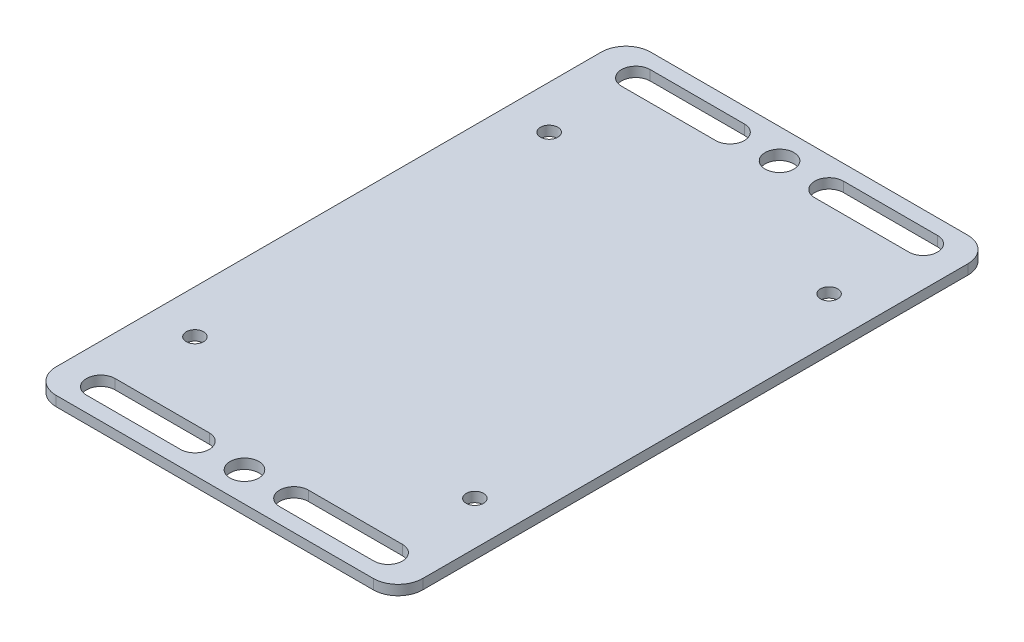
ISO-10303-21;
HEADER;
FILE_DESCRIPTION(('STEP AP214'),'2;1');
FILE_NAME('part.step','',(''),(''),'','','');
FILE_SCHEMA(('AUTOMOTIVE_DESIGN { 1 0 10303 214 1 1 1 1 }'));
ENDSEC;
DATA;
#1=APPLICATION_CONTEXT('core data for automotive mechanical design processes');
#2=APPLICATION_PROTOCOL_DEFINITION('international standard','automotive_design',2000,#1);
#3=PRODUCT_CONTEXT('',#1,'mechanical');
#4=PRODUCT('Part','Part','',(#3));
#5=PRODUCT_RELATED_PRODUCT_CATEGORY('part','',(#4));
#6=PRODUCT_DEFINITION_FORMATION('','',#4);
#7=PRODUCT_DEFINITION_CONTEXT('part definition',#1,'design');
#8=PRODUCT_DEFINITION('design','',#6,#7);
#9=PRODUCT_DEFINITION_SHAPE('','',#8);
#10=(LENGTH_UNIT() NAMED_UNIT(*) SI_UNIT(.MILLI.,.METRE.));
#11=(NAMED_UNIT(*) PLANE_ANGLE_UNIT() SI_UNIT($,.RADIAN.));
#12=(NAMED_UNIT(*) SI_UNIT($,.STERADIAN.) SOLID_ANGLE_UNIT());
#13=UNCERTAINTY_MEASURE_WITH_UNIT(LENGTH_MEASURE(1.E-05),#10,'distance_accuracy_value','');
#14=(GEOMETRIC_REPRESENTATION_CONTEXT(3) GLOBAL_UNCERTAINTY_ASSIGNED_CONTEXT((#13)) GLOBAL_UNIT_ASSIGNED_CONTEXT((#10,
#11,#12)) REPRESENTATION_CONTEXT('',''));
#15=CARTESIAN_POINT('',(0.,0.,0.));
#16=DIRECTION('',(0.,0.,1.));
#17=DIRECTION('',(1.,0.,0.));
#18=AXIS2_PLACEMENT_3D('',#15,#16,#17);
#19=CARTESIAN_POINT('',(0.,2.,0.));
#20=DIRECTION('',(0.,1.,0.));
#21=DIRECTION('',(0.,0.,1.));
#22=AXIS2_PLACEMENT_3D('',#19,#20,#21);
#23=PLANE('',#22);
#24=CARTESIAN_POINT('',(28.25,2.,-35.75));
#25=DIRECTION('',(0.,1.,0.));
#26=DIRECTION('',(0.,0.,1.));
#27=AXIS2_PLACEMENT_3D('',#24,#25,#26);
#28=CIRCLE('',#27,1.75);
#29=CARTESIAN_POINT('',(28.25,2.,-34.));
#30=VERTEX_POINT('',#29);
#31=EDGE_CURVE('E719',#30,#30,#28,.T.);
#32=ORIENTED_EDGE('',*,*,#31,.F.);
#33=EDGE_LOOP('',(#32));
#34=FACE_BOUND('',#33,.T.);
#35=CARTESIAN_POINT('',(-28.25,2.,35.75));
#36=DIRECTION('',(0.,1.,0.));
#37=DIRECTION('',(0.,0.,1.));
#38=AXIS2_PLACEMENT_3D('',#35,#36,#37);
#39=CIRCLE('',#38,1.75);
#40=CARTESIAN_POINT('',(-28.25,2.,37.5));
#41=VERTEX_POINT('',#40);
#42=EDGE_CURVE('E724',#41,#41,#39,.T.);
#43=ORIENTED_EDGE('',*,*,#42,.F.);
#44=EDGE_LOOP('',(#43));
#45=FACE_BOUND('',#44,.T.);
#46=CARTESIAN_POINT('',(28.25,2.,35.75));
#47=DIRECTION('',(0.,1.,0.));
#48=DIRECTION('',(0.,0.,1.));
#49=AXIS2_PLACEMENT_3D('',#46,#47,#48);
#50=CIRCLE('',#49,1.75);
#51=CARTESIAN_POINT('',(28.25,2.,37.5));
#52=VERTEX_POINT('',#51);
#53=EDGE_CURVE('E740',#52,#52,#50,.T.);
#54=ORIENTED_EDGE('',*,*,#53,.F.);
#55=EDGE_LOOP('',(#54));
#56=FACE_BOUND('',#55,.T.);
#57=CARTESIAN_POINT('',(-28.25,2.,-35.75));
#58=DIRECTION('',(0.,1.,0.));
#59=DIRECTION('',(0.,0.,1.));
#60=AXIS2_PLACEMENT_3D('',#57,#58,#59);
#61=CIRCLE('',#60,1.75);
#62=CARTESIAN_POINT('',(-28.25,2.,-34.));
#63=VERTEX_POINT('',#62);
#64=EDGE_CURVE('E231',#63,#63,#61,.T.);
#65=ORIENTED_EDGE('',*,*,#64,.F.);
#66=EDGE_LOOP('',(#65));
#67=FACE_BOUND('',#66,.T.);
#68=DIRECTION('',(-1.,0.,0.));
#69=VECTOR('',#68,1.);
#70=CARTESIAN_POINT('',(9.99999999999999,2.,56.9));
#71=LINE('',#70,#69);
#72=CARTESIAN_POINT('',(29.,2.,56.9));
#73=VERTEX_POINT('',#72);
#74=CARTESIAN_POINT('',(9.99999999999999,2.,56.9));
#75=VERTEX_POINT('',#74);
#76=EDGE_CURVE('E268',#73,#75,#71,.T.);
#77=ORIENTED_EDGE('',*,*,#76,.T.);
#78=CARTESIAN_POINT('',(9.99999999999999,2.,54.));
#79=DIRECTION('',(0.,-1.,0.));
#80=DIRECTION('',(0.,0.,-1.));
#81=AXIS2_PLACEMENT_3D('',#78,#79,#80);
#82=CIRCLE('',#81,2.9);
#83=CARTESIAN_POINT('',(9.99999999999999,2.,51.1));
#84=VERTEX_POINT('',#83);
#85=EDGE_CURVE('E265',#75,#84,#82,.T.);
#86=ORIENTED_EDGE('',*,*,#85,.T.);
#87=DIRECTION('',(1.,0.,0.));
#88=VECTOR('',#87,1.);
#89=CARTESIAN_POINT('',(9.99999999999999,2.,51.1));
#90=LINE('',#89,#88);
#91=CARTESIAN_POINT('',(29.,2.,51.1));
#92=VERTEX_POINT('',#91);
#93=EDGE_CURVE('E257',#84,#92,#90,.T.);
#94=ORIENTED_EDGE('',*,*,#93,.T.);
#95=CARTESIAN_POINT('',(29.,2.,54.));
#96=DIRECTION('',(0.,-1.,0.));
#97=DIRECTION('',(0.,0.,-1.));
#98=AXIS2_PLACEMENT_3D('',#95,#96,#97);
#99=CIRCLE('',#98,2.9);
#100=EDGE_CURVE('E272',#92,#73,#99,.T.);
#101=ORIENTED_EDGE('',*,*,#100,.T.);
#102=EDGE_LOOP('',(#77,#86,#94,#101));
#103=FACE_BOUND('',#102,.T.);
#104=DIRECTION('',(0.,0.,1.));
#105=VECTOR('',#104,1.);
#106=CARTESIAN_POINT('',(-37.,2.,-60.));
#107=LINE('',#106,#105);
#108=CARTESIAN_POINT('',(-37.,2.,-55.));
#109=VERTEX_POINT('',#108);
#110=CARTESIAN_POINT('',(-37.,2.,55.));
#111=VERTEX_POINT('',#110);
#112=EDGE_CURVE('E360',#109,#111,#107,.T.);
#113=ORIENTED_EDGE('',*,*,#112,.T.);
#114=CARTESIAN_POINT('',(-32.,2.,55.));
#115=DIRECTION('',(0.,1.,0.));
#116=DIRECTION('',(0.,0.,1.));
#117=AXIS2_PLACEMENT_3D('',#114,#115,#116);
#118=CIRCLE('',#117,5.);
#119=CARTESIAN_POINT('',(-32.,2.,60.));
#120=VERTEX_POINT('',#119);
#121=EDGE_CURVE('E398',#111,#120,#118,.T.);
#122=ORIENTED_EDGE('',*,*,#121,.T.);
#123=DIRECTION('',(1.,0.,0.));
#124=VECTOR('',#123,1.);
#125=CARTESIAN_POINT('',(-37.,2.,60.));
#126=LINE('',#125,#124);
#127=CARTESIAN_POINT('',(32.,2.,60.));
#128=VERTEX_POINT('',#127);
#129=EDGE_CURVE('E363',#120,#128,#126,.T.);
#130=ORIENTED_EDGE('',*,*,#129,.T.);
#131=CARTESIAN_POINT('',(32.,2.,55.));
#132=DIRECTION('',(0.,1.,0.));
#133=DIRECTION('',(0.,0.,1.));
#134=AXIS2_PLACEMENT_3D('',#131,#132,#133);
#135=CIRCLE('',#134,5.);
#136=CARTESIAN_POINT('',(37.,2.,55.));
#137=VERTEX_POINT('',#136);
#138=EDGE_CURVE('E396',#128,#137,#135,.T.);
#139=ORIENTED_EDGE('',*,*,#138,.T.);
#140=DIRECTION('',(0.,0.,-1.));
#141=VECTOR('',#140,1.);
#142=CARTESIAN_POINT('',(37.,2.,-60.));
#143=LINE('',#142,#141);
#144=CARTESIAN_POINT('',(37.,2.,-55.));
#145=VERTEX_POINT('',#144);
#146=EDGE_CURVE('E355',#137,#145,#143,.T.);
#147=ORIENTED_EDGE('',*,*,#146,.T.);
#148=CARTESIAN_POINT('',(32.,2.,-55.));
#149=DIRECTION('',(0.,1.,0.));
#150=DIRECTION('',(0.,0.,1.));
#151=AXIS2_PLACEMENT_3D('',#148,#149,#150);
#152=CIRCLE('',#151,5.);
#153=CARTESIAN_POINT('',(32.,2.,-60.));
#154=VERTEX_POINT('',#153);
#155=EDGE_CURVE('E60',#145,#154,#152,.T.);
#156=ORIENTED_EDGE('',*,*,#155,.T.);
#157=DIRECTION('',(-1.,0.,0.));
#158=VECTOR('',#157,1.);
#159=CARTESIAN_POINT('',(-37.,2.,-60.));
#160=LINE('',#159,#158);
#161=CARTESIAN_POINT('',(-32.,2.,-60.));
#162=VERTEX_POINT('',#161);
#163=EDGE_CURVE('E357',#154,#162,#160,.T.);
#164=ORIENTED_EDGE('',*,*,#163,.T.);
#165=CARTESIAN_POINT('',(-32.,2.,-55.));
#166=DIRECTION('',(0.,1.,0.));
#167=DIRECTION('',(0.,0.,1.));
#168=AXIS2_PLACEMENT_3D('',#165,#166,#167);
#169=CIRCLE('',#168,5.);
#170=EDGE_CURVE('E393',#162,#109,#169,.T.);
#171=ORIENTED_EDGE('',*,*,#170,.T.);
#172=EDGE_LOOP('',(#113,#122,#130,#139,#147,#156,#164,#171));
#173=FACE_BOUND('',#172,.T.);
#174=CARTESIAN_POINT('',(9.99999999999999,2.,-54.));
#175=DIRECTION('',(0.,1.,0.));
#176=DIRECTION('',(0.,0.,1.));
#177=AXIS2_PLACEMENT_3D('',#174,#175,#176);
#178=CIRCLE('',#177,2.9);
#179=CARTESIAN_POINT('',(9.99999999999999,2.,-56.9));
#180=VERTEX_POINT('',#179);
#181=CARTESIAN_POINT('',(9.99999999999999,2.,-51.1));
#182=VERTEX_POINT('',#181);
#183=EDGE_CURVE('E244',#180,#182,#178,.T.);
#184=ORIENTED_EDGE('',*,*,#183,.F.);
#185=DIRECTION('',(-1.,0.,0.));
#186=VECTOR('',#185,1.);
#187=CARTESIAN_POINT('',(9.99999999999999,2.,-56.9));
#188=LINE('',#187,#186);
#189=CARTESIAN_POINT('',(29.,2.,-56.9));
#190=VERTEX_POINT('',#189);
#191=EDGE_CURVE('E329',#190,#180,#188,.T.);
#192=ORIENTED_EDGE('',*,*,#191,.F.);
#193=CARTESIAN_POINT('',(29.,2.,-54.));
#194=DIRECTION('',(0.,1.,0.));
#195=DIRECTION('',(0.,0.,1.));
#196=AXIS2_PLACEMENT_3D('',#193,#194,#195);
#197=CIRCLE('',#196,2.9);
#198=CARTESIAN_POINT('',(29.,2.,-51.1));
#199=VERTEX_POINT('',#198);
#200=EDGE_CURVE('E343',#199,#190,#197,.T.);
#201=ORIENTED_EDGE('',*,*,#200,.F.);
#202=DIRECTION('',(1.,0.,0.));
#203=VECTOR('',#202,1.);
#204=CARTESIAN_POINT('',(9.99999999999999,2.,-51.1));
#205=LINE('',#204,#203);
#206=EDGE_CURVE('E340',#182,#199,#205,.T.);
#207=ORIENTED_EDGE('',*,*,#206,.F.);
#208=EDGE_LOOP('',(#184,#192,#201,#207));
#209=FACE_BOUND('',#208,.T.);
#210=CARTESIAN_POINT('',(0.,2.,-54.));
#211=DIRECTION('',(0.,1.,0.));
#212=DIRECTION('',(0.,0.,1.));
#213=AXIS2_PLACEMENT_3D('',#210,#211,#212);
#214=CIRCLE('',#213,2.9);
#215=CARTESIAN_POINT('',(0.,2.,-51.1));
#216=VERTEX_POINT('',#215);
#217=EDGE_CURVE('E321',#216,#216,#214,.T.);
#218=ORIENTED_EDGE('',*,*,#217,.F.);
#219=EDGE_LOOP('',(#218));
#220=FACE_BOUND('',#219,.T.);
#221=CARTESIAN_POINT('',(-29.,2.,-54.));
#222=DIRECTION('',(0.,1.,0.));
#223=DIRECTION('',(0.,0.,1.));
#224=AXIS2_PLACEMENT_3D('',#221,#222,#223);
#225=CIRCLE('',#224,2.9);
#226=CARTESIAN_POINT('',(-29.,2.,-56.9));
#227=VERTEX_POINT('',#226);
#228=CARTESIAN_POINT('',(-29.,2.,-51.1));
#229=VERTEX_POINT('',#228);
#230=EDGE_CURVE('E299',#227,#229,#225,.T.);
#231=ORIENTED_EDGE('',*,*,#230,.F.);
#232=DIRECTION('',(-1.,0.,0.));
#233=VECTOR('',#232,1.);
#234=CARTESIAN_POINT('',(-29.,2.,-56.9));
#235=LINE('',#234,#233);
#236=CARTESIAN_POINT('',(-10.,2.,-56.9));
#237=VERTEX_POINT('',#236);
#238=EDGE_CURVE('E289',#237,#227,#235,.T.);
#239=ORIENTED_EDGE('',*,*,#238,.F.);
#240=CARTESIAN_POINT('',(-10.,2.,-54.));
#241=DIRECTION('',(0.,1.,0.));
#242=DIRECTION('',(0.,0.,1.));
#243=AXIS2_PLACEMENT_3D('',#240,#241,#242);
#244=CIRCLE('',#243,2.9);
#245=CARTESIAN_POINT('',(-10.,2.,-51.1));
#246=VERTEX_POINT('',#245);
#247=EDGE_CURVE('E305',#246,#237,#244,.T.);
#248=ORIENTED_EDGE('',*,*,#247,.F.);
#249=DIRECTION('',(1.,0.,0.));
#250=VECTOR('',#249,1.);
#251=CARTESIAN_POINT('',(-29.,2.,-51.1));
#252=LINE('',#251,#250);
#253=EDGE_CURVE('E301',#229,#246,#252,.T.);
#254=ORIENTED_EDGE('',*,*,#253,.F.);
#255=EDGE_LOOP('',(#231,#239,#248,#254));
#256=FACE_BOUND('',#255,.T.);
#257=CARTESIAN_POINT('',(0.,2.,54.));
#258=DIRECTION('',(0.,-1.,0.));
#259=DIRECTION('',(0.,0.,-1.));
#260=AXIS2_PLACEMENT_3D('',#257,#258,#259);
#261=CIRCLE('',#260,2.9);
#262=CARTESIAN_POINT('',(0.,2.,51.1));
#263=VERTEX_POINT('',#262);
#264=EDGE_CURVE('E250',#263,#263,#261,.T.);
#265=ORIENTED_EDGE('',*,*,#264,.T.);
#266=EDGE_LOOP('',(#265));
#267=FACE_BOUND('',#266,.T.);
#268=DIRECTION('',(-1.,0.,0.));
#269=VECTOR('',#268,1.);
#270=CARTESIAN_POINT('',(-29.,2.,56.9));
#271=LINE('',#270,#269);
#272=CARTESIAN_POINT('',(-10.,2.,56.9));
#273=VERTEX_POINT('',#272);
#274=CARTESIAN_POINT('',(-29.,2.,56.9));
#275=VERTEX_POINT('',#274);
#276=EDGE_CURVE('E237',#273,#275,#271,.T.);
#277=ORIENTED_EDGE('',*,*,#276,.T.);
#278=CARTESIAN_POINT('',(-29.,2.,54.));
#279=DIRECTION('',(0.,-1.,0.));
#280=DIRECTION('',(0.,0.,-1.));
#281=AXIS2_PLACEMENT_3D('',#278,#279,#280);
#282=CIRCLE('',#281,2.9);
#283=CARTESIAN_POINT('',(-29.,2.,51.1));
#284=VERTEX_POINT('',#283);
#285=EDGE_CURVE('E220',#275,#284,#282,.T.);
#286=ORIENTED_EDGE('',*,*,#285,.T.);
#287=DIRECTION('',(1.,0.,0.));
#288=VECTOR('',#287,1.);
#289=CARTESIAN_POINT('',(-29.,2.,51.1));
#290=LINE('',#289,#288);
#291=CARTESIAN_POINT('',(-10.,2.,51.1));
#292=VERTEX_POINT('',#291);
#293=EDGE_CURVE('E225',#284,#292,#290,.T.);
#294=ORIENTED_EDGE('',*,*,#293,.T.);
#295=CARTESIAN_POINT('',(-10.,2.,54.));
#296=DIRECTION('',(0.,-1.,0.));
#297=DIRECTION('',(0.,0.,-1.));
#298=AXIS2_PLACEMENT_3D('',#295,#296,#297);
#299=CIRCLE('',#298,2.9);
#300=EDGE_CURVE('E228',#292,#273,#299,.T.);
#301=ORIENTED_EDGE('',*,*,#300,.T.);
#302=EDGE_LOOP('',(#277,#286,#294,#301));
#303=FACE_BOUND('',#302,.T.);
#304=ADVANCED_FACE('F39',(#34,#45,#56,#67,#103,#173,#209,#220,#256,#267,#303),#23,.T.);
#305=CARTESIAN_POINT('',(0.,0.,0.));
#306=DIRECTION('',(0.,1.,0.));
#307=DIRECTION('',(0.,0.,1.));
#308=AXIS2_PLACEMENT_3D('',#305,#306,#307);
#309=PLANE('',#308);
#310=CARTESIAN_POINT('',(28.25,0.,-35.75));
#311=DIRECTION('',(0.,1.,0.));
#312=DIRECTION('',(0.,0.,1.));
#313=AXIS2_PLACEMENT_3D('',#310,#311,#312);
#314=CIRCLE('',#313,1.75);
#315=CARTESIAN_POINT('',(28.25,0.,-34.));
#316=VERTEX_POINT('',#315);
#317=EDGE_CURVE('E717',#316,#316,#314,.T.);
#318=ORIENTED_EDGE('',*,*,#317,.T.);
#319=EDGE_LOOP('',(#318));
#320=FACE_BOUND('',#319,.T.);
#321=CARTESIAN_POINT('',(-28.25,0.,35.75));
#322=DIRECTION('',(0.,1.,0.));
#323=DIRECTION('',(0.,0.,1.));
#324=AXIS2_PLACEMENT_3D('',#321,#322,#323);
#325=CIRCLE('',#324,1.75);
#326=CARTESIAN_POINT('',(-28.25,0.,37.5));
#327=VERTEX_POINT('',#326);
#328=EDGE_CURVE('E720',#327,#327,#325,.T.);
#329=ORIENTED_EDGE('',*,*,#328,.T.);
#330=EDGE_LOOP('',(#329));
#331=FACE_BOUND('',#330,.T.);
#332=CARTESIAN_POINT('',(28.25,0.,35.75));
#333=DIRECTION('',(0.,1.,0.));
#334=DIRECTION('',(0.,0.,1.));
#335=AXIS2_PLACEMENT_3D('',#332,#333,#334);
#336=CIRCLE('',#335,1.75);
#337=CARTESIAN_POINT('',(28.25,0.,37.5));
#338=VERTEX_POINT('',#337);
#339=EDGE_CURVE('E729',#338,#338,#336,.T.);
#340=ORIENTED_EDGE('',*,*,#339,.T.);
#341=EDGE_LOOP('',(#340));
#342=FACE_BOUND('',#341,.T.);
#343=CARTESIAN_POINT('',(-28.25,0.,-35.75));
#344=DIRECTION('',(0.,1.,0.));
#345=DIRECTION('',(0.,0.,1.));
#346=AXIS2_PLACEMENT_3D('',#343,#344,#345);
#347=CIRCLE('',#346,1.75);
#348=CARTESIAN_POINT('',(-28.25,0.,-34.));
#349=VERTEX_POINT('',#348);
#350=EDGE_CURVE('E269',#349,#349,#347,.T.);
#351=ORIENTED_EDGE('',*,*,#350,.T.);
#352=EDGE_LOOP('',(#351));
#353=FACE_BOUND('',#352,.T.);
#354=CARTESIAN_POINT('',(0.,0.,54.));
#355=DIRECTION('',(0.,-1.,0.));
#356=DIRECTION('',(0.,0.,-1.));
#357=AXIS2_PLACEMENT_3D('',#354,#355,#356);
#358=CIRCLE('',#357,2.9);
#359=CARTESIAN_POINT('',(0.,0.,51.1));
#360=VERTEX_POINT('',#359);
#361=EDGE_CURVE('E238',#360,#360,#358,.T.);
#362=ORIENTED_EDGE('',*,*,#361,.F.);
#363=EDGE_LOOP('',(#362));
#364=FACE_BOUND('',#363,.T.);
#365=CARTESIAN_POINT('',(9.99999999999999,0.,54.));
#366=DIRECTION('',(0.,-1.,0.));
#367=DIRECTION('',(0.,0.,-1.));
#368=AXIS2_PLACEMENT_3D('',#365,#366,#367);
#369=CIRCLE('',#368,2.9);
#370=CARTESIAN_POINT('',(9.99999999999999,0.,56.9));
#371=VERTEX_POINT('',#370);
#372=CARTESIAN_POINT('',(9.99999999999999,0.,51.1));
#373=VERTEX_POINT('',#372);
#374=EDGE_CURVE('E254',#371,#373,#369,.T.);
#375=ORIENTED_EDGE('',*,*,#374,.F.);
#376=DIRECTION('',(-1.,0.,0.));
#377=VECTOR('',#376,1.);
#378=CARTESIAN_POINT('',(9.99999999999999,0.,56.9));
#379=LINE('',#378,#377);
#380=CARTESIAN_POINT('',(29.,0.,56.9));
#381=VERTEX_POINT('',#380);
#382=EDGE_CURVE('E256',#381,#371,#379,.T.);
#383=ORIENTED_EDGE('',*,*,#382,.F.);
#384=CARTESIAN_POINT('',(29.,0.,54.));
#385=DIRECTION('',(0.,-1.,0.));
#386=DIRECTION('',(0.,0.,-1.));
#387=AXIS2_PLACEMENT_3D('',#384,#385,#386);
#388=CIRCLE('',#387,2.9);
#389=CARTESIAN_POINT('',(29.,0.,51.1));
#390=VERTEX_POINT('',#389);
#391=EDGE_CURVE('E259',#390,#381,#388,.T.);
#392=ORIENTED_EDGE('',*,*,#391,.F.);
#393=DIRECTION('',(1.,0.,0.));
#394=VECTOR('',#393,1.);
#395=CARTESIAN_POINT('',(9.99999999999999,0.,51.1));
#396=LINE('',#395,#394);
#397=EDGE_CURVE('E262',#373,#390,#396,.T.);
#398=ORIENTED_EDGE('',*,*,#397,.F.);
#399=EDGE_LOOP('',(#375,#383,#392,#398));
#400=FACE_BOUND('',#399,.T.);
#401=DIRECTION('',(-1.,0.,0.));
#402=VECTOR('',#401,1.);
#403=CARTESIAN_POINT('',(-29.,0.,-56.9));
#404=LINE('',#403,#402);
#405=CARTESIAN_POINT('',(-10.,0.,-56.9));
#406=VERTEX_POINT('',#405);
#407=CARTESIAN_POINT('',(-29.,0.,-56.9));
#408=VERTEX_POINT('',#407);
#409=EDGE_CURVE('E295',#406,#408,#404,.T.);
#410=ORIENTED_EDGE('',*,*,#409,.T.);
#411=CARTESIAN_POINT('',(-29.,0.,-54.));
#412=DIRECTION('',(0.,1.,0.));
#413=DIRECTION('',(0.,0.,1.));
#414=AXIS2_PLACEMENT_3D('',#411,#412,#413);
#415=CIRCLE('',#414,2.9);
#416=CARTESIAN_POINT('',(-29.,0.,-51.1));
#417=VERTEX_POINT('',#416);
#418=EDGE_CURVE('E285',#408,#417,#415,.T.);
#419=ORIENTED_EDGE('',*,*,#418,.T.);
#420=DIRECTION('',(1.,0.,0.));
#421=VECTOR('',#420,1.);
#422=CARTESIAN_POINT('',(-29.,0.,-51.1));
#423=LINE('',#422,#421);
#424=CARTESIAN_POINT('',(-10.,0.,-51.1));
#425=VERTEX_POINT('',#424);
#426=EDGE_CURVE('E288',#417,#425,#423,.T.);
#427=ORIENTED_EDGE('',*,*,#426,.T.);
#428=CARTESIAN_POINT('',(-10.,0.,-54.));
#429=DIRECTION('',(0.,1.,0.));
#430=DIRECTION('',(0.,0.,1.));
#431=AXIS2_PLACEMENT_3D('',#428,#429,#430);
#432=CIRCLE('',#431,2.9);
#433=EDGE_CURVE('E292',#425,#406,#432,.T.);
#434=ORIENTED_EDGE('',*,*,#433,.T.);
#435=EDGE_LOOP('',(#410,#419,#427,#434));
#436=FACE_BOUND('',#435,.T.);
#437=CARTESIAN_POINT('',(0.,0.,-54.));
#438=DIRECTION('',(0.,1.,0.));
#439=DIRECTION('',(0.,0.,1.));
#440=AXIS2_PLACEMENT_3D('',#437,#438,#439);
#441=CIRCLE('',#440,2.9);
#442=CARTESIAN_POINT('',(0.,0.,-51.1));
#443=VERTEX_POINT('',#442);
#444=EDGE_CURVE('E302',#443,#443,#441,.T.);
#445=ORIENTED_EDGE('',*,*,#444,.T.);
#446=EDGE_LOOP('',(#445));
#447=FACE_BOUND('',#446,.T.);
#448=DIRECTION('',(-1.,0.,0.));
#449=VECTOR('',#448,1.);
#450=CARTESIAN_POINT('',(9.99999999999999,0.,-56.9));
#451=LINE('',#450,#449);
#452=CARTESIAN_POINT('',(29.,0.,-56.9));
#453=VERTEX_POINT('',#452);
#454=CARTESIAN_POINT('',(9.99999999999999,0.,-56.9));
#455=VERTEX_POINT('',#454);
#456=EDGE_CURVE('E335',#453,#455,#451,.T.);
#457=ORIENTED_EDGE('',*,*,#456,.T.);
#458=CARTESIAN_POINT('',(9.99999999999999,0.,-54.));
#459=DIRECTION('',(0.,1.,0.));
#460=DIRECTION('',(0.,0.,1.));
#461=AXIS2_PLACEMENT_3D('',#458,#459,#460);
#462=CIRCLE('',#461,2.9);
#463=CARTESIAN_POINT('',(9.99999999999999,0.,-51.1));
#464=VERTEX_POINT('',#463);
#465=EDGE_CURVE('E325',#455,#464,#462,.T.);
#466=ORIENTED_EDGE('',*,*,#465,.T.);
#467=DIRECTION('',(1.,0.,0.));
#468=VECTOR('',#467,1.);
#469=CARTESIAN_POINT('',(9.99999999999999,0.,-51.1));
#470=LINE('',#469,#468);
#471=CARTESIAN_POINT('',(29.,0.,-51.1));
#472=VERTEX_POINT('',#471);
#473=EDGE_CURVE('E328',#464,#472,#470,.T.);
#474=ORIENTED_EDGE('',*,*,#473,.T.);
#475=CARTESIAN_POINT('',(29.,0.,-54.));
#476=DIRECTION('',(0.,1.,0.));
#477=DIRECTION('',(0.,0.,1.));
#478=AXIS2_PLACEMENT_3D('',#475,#476,#477);
#479=CIRCLE('',#478,2.9);
#480=EDGE_CURVE('E332',#472,#453,#479,.T.);
#481=ORIENTED_EDGE('',*,*,#480,.T.);
#482=EDGE_LOOP('',(#457,#466,#474,#481));
#483=FACE_BOUND('',#482,.T.);
#484=DIRECTION('',(1.,0.,0.));
#485=VECTOR('',#484,1.);
#486=CARTESIAN_POINT('',(-37.,0.,60.));
#487=LINE('',#486,#485);
#488=CARTESIAN_POINT('',(-32.,0.,60.));
#489=VERTEX_POINT('',#488);
#490=CARTESIAN_POINT('',(32.,0.,60.));
#491=VERTEX_POINT('',#490);
#492=EDGE_CURVE('E358',#489,#491,#487,.T.);
#493=ORIENTED_EDGE('',*,*,#492,.F.);
#494=CARTESIAN_POINT('',(-32.,0.,55.));
#495=DIRECTION('',(0.,1.,0.));
#496=DIRECTION('',(0.,0.,1.));
#497=AXIS2_PLACEMENT_3D('',#494,#495,#496);
#498=CIRCLE('',#497,5.);
#499=CARTESIAN_POINT('',(-37.,0.,55.));
#500=VERTEX_POINT('',#499);
#501=EDGE_CURVE('E386',#489,#500,#498,.F.);
#502=ORIENTED_EDGE('',*,*,#501,.T.);
#503=DIRECTION('',(0.,0.,1.));
#504=VECTOR('',#503,1.);
#505=CARTESIAN_POINT('',(-37.,0.,-60.));
#506=LINE('',#505,#504);
#507=CARTESIAN_POINT('',(-37.,0.,-55.));
#508=VERTEX_POINT('',#507);
#509=EDGE_CURVE('E371',#508,#500,#506,.T.);
#510=ORIENTED_EDGE('',*,*,#509,.F.);
#511=CARTESIAN_POINT('',(-32.,0.,-55.));
#512=DIRECTION('',(0.,1.,0.));
#513=DIRECTION('',(0.,0.,1.));
#514=AXIS2_PLACEMENT_3D('',#511,#512,#513);
#515=CIRCLE('',#514,5.);
#516=CARTESIAN_POINT('',(-32.,0.,-60.));
#517=VERTEX_POINT('',#516);
#518=EDGE_CURVE('E380',#508,#517,#515,.F.);
#519=ORIENTED_EDGE('',*,*,#518,.T.);
#520=DIRECTION('',(-1.,0.,0.));
#521=VECTOR('',#520,1.);
#522=CARTESIAN_POINT('',(-37.,0.,-60.));
#523=LINE('',#522,#521);
#524=CARTESIAN_POINT('',(32.,0.,-60.));
#525=VERTEX_POINT('',#524);
#526=EDGE_CURVE('E369',#525,#517,#523,.T.);
#527=ORIENTED_EDGE('',*,*,#526,.F.);
#528=CARTESIAN_POINT('',(32.,0.,-55.));
#529=DIRECTION('',(0.,1.,0.));
#530=DIRECTION('',(0.,0.,1.));
#531=AXIS2_PLACEMENT_3D('',#528,#529,#530);
#532=CIRCLE('',#531,5.);
#533=CARTESIAN_POINT('',(37.,0.,-55.));
#534=VERTEX_POINT('',#533);
#535=EDGE_CURVE('E382',#525,#534,#532,.F.);
#536=ORIENTED_EDGE('',*,*,#535,.T.);
#537=DIRECTION('',(0.,0.,-1.));
#538=VECTOR('',#537,1.);
#539=CARTESIAN_POINT('',(37.,0.,-60.));
#540=LINE('',#539,#538);
#541=CARTESIAN_POINT('',(37.,0.,55.));
#542=VERTEX_POINT('',#541);
#543=EDGE_CURVE('E312',#542,#534,#540,.T.);
#544=ORIENTED_EDGE('',*,*,#543,.F.);
#545=CARTESIAN_POINT('',(32.,0.,55.));
#546=DIRECTION('',(0.,1.,0.));
#547=DIRECTION('',(0.,0.,1.));
#548=AXIS2_PLACEMENT_3D('',#545,#546,#547);
#549=CIRCLE('',#548,5.);
#550=EDGE_CURVE('E384',#542,#491,#549,.F.);
#551=ORIENTED_EDGE('',*,*,#550,.T.);
#552=EDGE_LOOP('',(#493,#502,#510,#519,#527,#536,#544,#551));
#553=FACE_BOUND('',#552,.T.);
#554=CARTESIAN_POINT('',(-29.,0.,54.));
#555=DIRECTION('',(0.,-1.,0.));
#556=DIRECTION('',(0.,0.,-1.));
#557=AXIS2_PLACEMENT_3D('',#554,#555,#556);
#558=CIRCLE('',#557,2.9);
#559=CARTESIAN_POINT('',(-29.,0.,56.9));
#560=VERTEX_POINT('',#559);
#561=CARTESIAN_POINT('',(-29.,0.,51.1));
#562=VERTEX_POINT('',#561);
#563=EDGE_CURVE('E213',#560,#562,#558,.T.);
#564=ORIENTED_EDGE('',*,*,#563,.F.);
#565=DIRECTION('',(-1.,0.,0.));
#566=VECTOR('',#565,1.);
#567=CARTESIAN_POINT('',(-29.,0.,56.9));
#568=LINE('',#567,#566);
#569=CARTESIAN_POINT('',(-10.,0.,56.9));
#570=VERTEX_POINT('',#569);
#571=EDGE_CURVE('E201',#570,#560,#568,.T.);
#572=ORIENTED_EDGE('',*,*,#571,.F.);
#573=CARTESIAN_POINT('',(-10.,0.,54.));
#574=DIRECTION('',(0.,-1.,0.));
#575=DIRECTION('',(0.,0.,-1.));
#576=AXIS2_PLACEMENT_3D('',#573,#574,#575);
#577=CIRCLE('',#576,2.9);
#578=CARTESIAN_POINT('',(-10.,0.,51.1));
#579=VERTEX_POINT('',#578);
#580=EDGE_CURVE('E212',#579,#570,#577,.T.);
#581=ORIENTED_EDGE('',*,*,#580,.F.);
#582=DIRECTION('',(1.,0.,0.));
#583=VECTOR('',#582,1.);
#584=CARTESIAN_POINT('',(-29.,0.,51.1));
#585=LINE('',#584,#583);
#586=EDGE_CURVE('E221',#562,#579,#585,.T.);
#587=ORIENTED_EDGE('',*,*,#586,.F.);
#588=EDGE_LOOP('',(#564,#572,#581,#587));
#589=FACE_BOUND('',#588,.T.);
#590=ADVANCED_FACE('F224',(#320,#331,#342,#353,#364,#400,#436,#447,#483,#553,#589),#309,.F.);
#591=CARTESIAN_POINT('',(37.,2.,-60.));
#592=DIRECTION('',(-1.,0.,0.));
#593=DIRECTION('',(0.,0.,1.));
#594=AXIS2_PLACEMENT_3D('',#591,#592,#593);
#595=PLANE('',#594);
#596=ORIENTED_EDGE('',*,*,#146,.F.);
#597=DIRECTION('',(0.,-1.,0.));
#598=VECTOR('',#597,1.);
#599=CARTESIAN_POINT('',(37.,2.,55.));
#600=LINE('',#599,#598);
#601=EDGE_CURVE('E402',#137,#542,#600,.T.);
#602=ORIENTED_EDGE('',*,*,#601,.T.);
#603=ORIENTED_EDGE('',*,*,#543,.T.);
#604=DIRECTION('',(0.,-1.,0.));
#605=VECTOR('',#604,1.);
#606=CARTESIAN_POINT('',(37.,2.,-55.));
#607=LINE('',#606,#605);
#608=EDGE_CURVE('E400',#534,#145,#607,.F.);
#609=ORIENTED_EDGE('',*,*,#608,.T.);
#610=EDGE_LOOP('',(#596,#602,#603,#609));
#611=FACE_BOUND('',#610,.T.);
#612=ADVANCED_FACE('F408',(#611),#595,.F.);
#613=CARTESIAN_POINT('',(-37.,2.,-60.));
#614=DIRECTION('',(0.,0.,1.));
#615=DIRECTION('',(1.,0.,0.));
#616=AXIS2_PLACEMENT_3D('',#613,#614,#615);
#617=PLANE('',#616);
#618=ORIENTED_EDGE('',*,*,#163,.F.);
#619=DIRECTION('',(0.,-1.,0.));
#620=VECTOR('',#619,1.);
#621=CARTESIAN_POINT('',(32.,2.,-60.));
#622=LINE('',#621,#620);
#623=EDGE_CURVE('E11',#154,#525,#622,.T.);
#624=ORIENTED_EDGE('',*,*,#623,.T.);
#625=ORIENTED_EDGE('',*,*,#526,.T.);
#626=DIRECTION('',(0.,-1.,0.));
#627=VECTOR('',#626,1.);
#628=CARTESIAN_POINT('',(-32.,2.,-60.));
#629=LINE('',#628,#627);
#630=EDGE_CURVE('E47',#517,#162,#629,.F.);
#631=ORIENTED_EDGE('',*,*,#630,.T.);
#632=EDGE_LOOP('',(#618,#624,#625,#631));
#633=FACE_BOUND('',#632,.T.);
#634=ADVANCED_FACE('F418',(#633),#617,.F.);
#635=CARTESIAN_POINT('',(-37.,2.,-60.));
#636=DIRECTION('',(1.,0.,0.));
#637=DIRECTION('',(0.,0.,-1.));
#638=AXIS2_PLACEMENT_3D('',#635,#636,#637);
#639=PLANE('',#638);
#640=ORIENTED_EDGE('',*,*,#509,.T.);
#641=DIRECTION('',(0.,-1.,0.));
#642=VECTOR('',#641,1.);
#643=CARTESIAN_POINT('',(-37.,2.,55.));
#644=LINE('',#643,#642);
#645=EDGE_CURVE('E391',#500,#111,#644,.F.);
#646=ORIENTED_EDGE('',*,*,#645,.T.);
#647=ORIENTED_EDGE('',*,*,#112,.F.);
#648=DIRECTION('',(0.,-1.,0.));
#649=VECTOR('',#648,1.);
#650=CARTESIAN_POINT('',(-37.,2.,-55.));
#651=LINE('',#650,#649);
#652=EDGE_CURVE('E388',#109,#508,#651,.T.);
#653=ORIENTED_EDGE('',*,*,#652,.T.);
#654=EDGE_LOOP('',(#640,#646,#647,#653));
#655=FACE_BOUND('',#654,.T.);
#656=ADVANCED_FACE('F426',(#655),#639,.F.);
#657=CARTESIAN_POINT('',(-37.,2.,60.));
#658=DIRECTION('',(0.,0.,-1.));
#659=DIRECTION('',(-1.,0.,0.));
#660=AXIS2_PLACEMENT_3D('',#657,#658,#659);
#661=PLANE('',#660);
#662=ORIENTED_EDGE('',*,*,#129,.F.);
#663=DIRECTION('',(0.,-1.,0.));
#664=VECTOR('',#663,1.);
#665=CARTESIAN_POINT('',(-32.,2.,60.));
#666=LINE('',#665,#664);
#667=EDGE_CURVE('E377',#120,#489,#666,.T.);
#668=ORIENTED_EDGE('',*,*,#667,.T.);
#669=ORIENTED_EDGE('',*,*,#492,.T.);
#670=DIRECTION('',(0.,-1.,0.));
#671=VECTOR('',#670,1.);
#672=CARTESIAN_POINT('',(32.,2.,60.));
#673=LINE('',#672,#671);
#674=EDGE_CURVE('E366',#491,#128,#673,.F.);
#675=ORIENTED_EDGE('',*,*,#674,.T.);
#676=EDGE_LOOP('',(#662,#668,#669,#675));
#677=FACE_BOUND('',#676,.T.);
#678=ADVANCED_FACE('F434',(#677),#661,.F.);
#679=CARTESIAN_POINT('',(9.99999999999999,0.,-54.));
#680=DIRECTION('',(0.,1.,0.));
#681=DIRECTION('',(0.,0.,1.));
#682=AXIS2_PLACEMENT_3D('',#679,#680,#681);
#683=CYLINDRICAL_SURFACE('',#682,2.9);
#684=ORIENTED_EDGE('',*,*,#183,.T.);
#685=DIRECTION('',(0.,1.,0.));
#686=VECTOR('',#685,1.);
#687=CARTESIAN_POINT('',(9.99999999999999,0.,-51.1));
#688=LINE('',#687,#686);
#689=EDGE_CURVE('E338',#464,#182,#688,.T.);
#690=ORIENTED_EDGE('',*,*,#689,.F.);
#691=ORIENTED_EDGE('',*,*,#465,.F.);
#692=DIRECTION('',(0.,1.,0.));
#693=VECTOR('',#692,1.);
#694=CARTESIAN_POINT('',(9.99999999999999,0.,-56.9));
#695=LINE('',#694,#693);
#696=EDGE_CURVE('E324',#455,#180,#695,.T.);
#697=ORIENTED_EDGE('',*,*,#696,.T.);
#698=EDGE_LOOP('',(#684,#690,#691,#697));
#699=FACE_BOUND('',#698,.T.);
#700=ADVANCED_FACE('F456',(#699),#683,.F.);
#701=CARTESIAN_POINT('',(9.99999999999999,0.,-56.9));
#702=DIRECTION('',(0.,0.,-1.));
#703=DIRECTION('',(-1.,0.,0.));
#704=AXIS2_PLACEMENT_3D('',#701,#702,#703);
#705=PLANE('',#704);
#706=ORIENTED_EDGE('',*,*,#191,.T.);
#707=ORIENTED_EDGE('',*,*,#696,.F.);
#708=ORIENTED_EDGE('',*,*,#456,.F.);
#709=DIRECTION('',(0.,1.,0.));
#710=VECTOR('',#709,1.);
#711=CARTESIAN_POINT('',(29.,0.,-56.9));
#712=LINE('',#711,#710);
#713=EDGE_CURVE('E349',#453,#190,#712,.T.);
#714=ORIENTED_EDGE('',*,*,#713,.T.);
#715=EDGE_LOOP('',(#706,#707,#708,#714));
#716=FACE_BOUND('',#715,.T.);
#717=ADVANCED_FACE('F590',(#716),#705,.F.);
#718=CARTESIAN_POINT('',(29.,0.,-54.));
#719=DIRECTION('',(0.,1.,0.));
#720=DIRECTION('',(0.,0.,1.));
#721=AXIS2_PLACEMENT_3D('',#718,#719,#720);
#722=CYLINDRICAL_SURFACE('',#721,2.9);
#723=ORIENTED_EDGE('',*,*,#200,.T.);
#724=ORIENTED_EDGE('',*,*,#713,.F.);
#725=ORIENTED_EDGE('',*,*,#480,.F.);
#726=DIRECTION('',(0.,1.,0.));
#727=VECTOR('',#726,1.);
#728=CARTESIAN_POINT('',(29.,0.,-51.1));
#729=LINE('',#728,#727);
#730=EDGE_CURVE('E351',#472,#199,#729,.T.);
#731=ORIENTED_EDGE('',*,*,#730,.T.);
#732=EDGE_LOOP('',(#723,#724,#725,#731));
#733=FACE_BOUND('',#732,.T.);
#734=ADVANCED_FACE('F593',(#733),#722,.F.);
#735=CARTESIAN_POINT('',(9.99999999999999,0.,-51.1));
#736=DIRECTION('',(0.,0.,1.));
#737=DIRECTION('',(1.,0.,0.));
#738=AXIS2_PLACEMENT_3D('',#735,#736,#737);
#739=PLANE('',#738);
#740=ORIENTED_EDGE('',*,*,#206,.T.);
#741=ORIENTED_EDGE('',*,*,#730,.F.);
#742=ORIENTED_EDGE('',*,*,#473,.F.);
#743=ORIENTED_EDGE('',*,*,#689,.T.);
#744=EDGE_LOOP('',(#740,#741,#742,#743));
#745=FACE_BOUND('',#744,.T.);
#746=ADVANCED_FACE('F588',(#745),#739,.F.);
#747=CARTESIAN_POINT('',(0.,0.,-54.));
#748=DIRECTION('',(0.,1.,0.));
#749=DIRECTION('',(0.,0.,1.));
#750=AXIS2_PLACEMENT_3D('',#747,#748,#749);
#751=CYLINDRICAL_SURFACE('',#750,2.9);
#752=ORIENTED_EDGE('',*,*,#444,.F.);
#753=EDGE_LOOP('',(#752));
#754=FACE_BOUND('',#753,.T.);
#755=ORIENTED_EDGE('',*,*,#217,.T.);
#756=EDGE_LOOP('',(#755));
#757=FACE_BOUND('',#756,.T.);
#758=ADVANCED_FACE('F584',(#754,#757),#751,.F.);
#759=CARTESIAN_POINT('',(-29.,0.,-54.));
#760=DIRECTION('',(0.,1.,0.));
#761=DIRECTION('',(0.,0.,1.));
#762=AXIS2_PLACEMENT_3D('',#759,#760,#761);
#763=CYLINDRICAL_SURFACE('',#762,2.9);
#764=ORIENTED_EDGE('',*,*,#230,.T.);
#765=DIRECTION('',(0.,1.,0.));
#766=VECTOR('',#765,1.);
#767=CARTESIAN_POINT('',(-29.,0.,-51.1));
#768=LINE('',#767,#766);
#769=EDGE_CURVE('E298',#417,#229,#768,.T.);
#770=ORIENTED_EDGE('',*,*,#769,.F.);
#771=ORIENTED_EDGE('',*,*,#418,.F.);
#772=DIRECTION('',(0.,1.,0.));
#773=VECTOR('',#772,1.);
#774=CARTESIAN_POINT('',(-29.,0.,-56.9));
#775=LINE('',#774,#773);
#776=EDGE_CURVE('E310',#408,#227,#775,.T.);
#777=ORIENTED_EDGE('',*,*,#776,.T.);
#778=EDGE_LOOP('',(#764,#770,#771,#777));
#779=FACE_BOUND('',#778,.T.);
#780=ADVANCED_FACE('F574',(#779),#763,.F.);
#781=CARTESIAN_POINT('',(-29.,0.,-56.9));
#782=DIRECTION('',(0.,0.,-1.));
#783=DIRECTION('',(-1.,0.,0.));
#784=AXIS2_PLACEMENT_3D('',#781,#782,#783);
#785=PLANE('',#784);
#786=ORIENTED_EDGE('',*,*,#238,.T.);
#787=ORIENTED_EDGE('',*,*,#776,.F.);
#788=ORIENTED_EDGE('',*,*,#409,.F.);
#789=DIRECTION('',(0.,1.,0.));
#790=VECTOR('',#789,1.);
#791=CARTESIAN_POINT('',(-10.,0.,-56.9));
#792=LINE('',#791,#790);
#793=EDGE_CURVE('E313',#406,#237,#792,.T.);
#794=ORIENTED_EDGE('',*,*,#793,.T.);
#795=EDGE_LOOP('',(#786,#787,#788,#794));
#796=FACE_BOUND('',#795,.T.);
#797=ADVANCED_FACE('F570',(#796),#785,.F.);
#798=CARTESIAN_POINT('',(-10.,0.,-54.));
#799=DIRECTION('',(0.,1.,0.));
#800=DIRECTION('',(0.,0.,1.));
#801=AXIS2_PLACEMENT_3D('',#798,#799,#800);
#802=CYLINDRICAL_SURFACE('',#801,2.9);
#803=ORIENTED_EDGE('',*,*,#247,.T.);
#804=ORIENTED_EDGE('',*,*,#793,.F.);
#805=ORIENTED_EDGE('',*,*,#433,.F.);
#806=DIRECTION('',(0.,1.,0.));
#807=VECTOR('',#806,1.);
#808=CARTESIAN_POINT('',(-10.,0.,-51.1));
#809=LINE('',#808,#807);
#810=EDGE_CURVE('E315',#425,#246,#809,.T.);
#811=ORIENTED_EDGE('',*,*,#810,.T.);
#812=EDGE_LOOP('',(#803,#804,#805,#811));
#813=FACE_BOUND('',#812,.T.);
#814=ADVANCED_FACE('F573',(#813),#802,.F.);
#815=CARTESIAN_POINT('',(-29.,0.,-51.1));
#816=DIRECTION('',(0.,0.,1.));
#817=DIRECTION('',(1.,0.,0.));
#818=AXIS2_PLACEMENT_3D('',#815,#816,#817);
#819=PLANE('',#818);
#820=ORIENTED_EDGE('',*,*,#253,.T.);
#821=ORIENTED_EDGE('',*,*,#810,.F.);
#822=ORIENTED_EDGE('',*,*,#426,.F.);
#823=ORIENTED_EDGE('',*,*,#769,.T.);
#824=EDGE_LOOP('',(#820,#821,#822,#823));
#825=FACE_BOUND('',#824,.T.);
#826=ADVANCED_FACE('F568',(#825),#819,.F.);
#827=CARTESIAN_POINT('',(9.99999999999999,0.,54.));
#828=DIRECTION('',(0.,1.,0.));
#829=DIRECTION('',(0.,0.,1.));
#830=AXIS2_PLACEMENT_3D('',#827,#828,#829);
#831=CYLINDRICAL_SURFACE('',#830,2.9);
#832=ORIENTED_EDGE('',*,*,#85,.F.);
#833=DIRECTION('',(0.,1.,0.));
#834=VECTOR('',#833,1.);
#835=CARTESIAN_POINT('',(9.99999999999999,0.,56.9));
#836=LINE('',#835,#834);
#837=EDGE_CURVE('E264',#371,#75,#836,.T.);
#838=ORIENTED_EDGE('',*,*,#837,.F.);
#839=ORIENTED_EDGE('',*,*,#374,.T.);
#840=DIRECTION('',(0.,1.,0.));
#841=VECTOR('',#840,1.);
#842=CARTESIAN_POINT('',(9.99999999999999,0.,51.1));
#843=LINE('',#842,#841);
#844=EDGE_CURVE('E253',#373,#84,#843,.T.);
#845=ORIENTED_EDGE('',*,*,#844,.T.);
#846=EDGE_LOOP('',(#832,#838,#839,#845));
#847=FACE_BOUND('',#846,.T.);
#848=ADVANCED_FACE('F558',(#847),#831,.F.);
#849=CARTESIAN_POINT('',(9.99999999999999,0.,51.1));
#850=DIRECTION('',(0.,0.,1.));
#851=DIRECTION('',(1.,0.,0.));
#852=AXIS2_PLACEMENT_3D('',#849,#850,#851);
#853=PLANE('',#852);
#854=ORIENTED_EDGE('',*,*,#93,.F.);
#855=ORIENTED_EDGE('',*,*,#844,.F.);
#856=ORIENTED_EDGE('',*,*,#397,.T.);
#857=DIRECTION('',(0.,1.,0.));
#858=VECTOR('',#857,1.);
#859=CARTESIAN_POINT('',(29.,0.,51.1));
#860=LINE('',#859,#858);
#861=EDGE_CURVE('E279',#390,#92,#860,.T.);
#862=ORIENTED_EDGE('',*,*,#861,.T.);
#863=EDGE_LOOP('',(#854,#855,#856,#862));
#864=FACE_BOUND('',#863,.T.);
#865=ADVANCED_FACE('F554',(#864),#853,.T.);
#866=CARTESIAN_POINT('',(29.,0.,54.));
#867=DIRECTION('',(0.,1.,0.));
#868=DIRECTION('',(0.,0.,1.));
#869=AXIS2_PLACEMENT_3D('',#866,#867,#868);
#870=CYLINDRICAL_SURFACE('',#869,2.9);
#871=ORIENTED_EDGE('',*,*,#100,.F.);
#872=ORIENTED_EDGE('',*,*,#861,.F.);
#873=ORIENTED_EDGE('',*,*,#391,.T.);
#874=DIRECTION('',(0.,1.,0.));
#875=VECTOR('',#874,1.);
#876=CARTESIAN_POINT('',(29.,0.,56.9));
#877=LINE('',#876,#875);
#878=EDGE_CURVE('E281',#381,#73,#877,.T.);
#879=ORIENTED_EDGE('',*,*,#878,.T.);
#880=EDGE_LOOP('',(#871,#872,#873,#879));
#881=FACE_BOUND('',#880,.T.);
#882=ADVANCED_FACE('F557',(#881),#870,.F.);
#883=CARTESIAN_POINT('',(9.99999999999999,0.,56.9));
#884=DIRECTION('',(0.,0.,-1.));
#885=DIRECTION('',(-1.,0.,0.));
#886=AXIS2_PLACEMENT_3D('',#883,#884,#885);
#887=PLANE('',#886);
#888=ORIENTED_EDGE('',*,*,#76,.F.);
#889=ORIENTED_EDGE('',*,*,#878,.F.);
#890=ORIENTED_EDGE('',*,*,#382,.T.);
#891=ORIENTED_EDGE('',*,*,#837,.T.);
#892=EDGE_LOOP('',(#888,#889,#890,#891));
#893=FACE_BOUND('',#892,.T.);
#894=ADVANCED_FACE('F552',(#893),#887,.T.);
#895=CARTESIAN_POINT('',(0.,0.,54.));
#896=DIRECTION('',(0.,1.,0.));
#897=DIRECTION('',(0.,0.,1.));
#898=AXIS2_PLACEMENT_3D('',#895,#896,#897);
#899=CYLINDRICAL_SURFACE('',#898,2.9);
#900=ORIENTED_EDGE('',*,*,#361,.T.);
#901=EDGE_LOOP('',(#900));
#902=FACE_BOUND('',#901,.T.);
#903=ORIENTED_EDGE('',*,*,#264,.F.);
#904=EDGE_LOOP('',(#903));
#905=FACE_BOUND('',#904,.T.);
#906=ADVANCED_FACE('F549',(#902,#905),#899,.F.);
#907=CARTESIAN_POINT('',(-29.,0.,54.));
#908=DIRECTION('',(0.,1.,0.));
#909=DIRECTION('',(0.,0.,1.));
#910=AXIS2_PLACEMENT_3D('',#907,#908,#909);
#911=CYLINDRICAL_SURFACE('',#910,2.9);
#912=ORIENTED_EDGE('',*,*,#285,.F.);
#913=DIRECTION('',(0.,1.,0.));
#914=VECTOR('',#913,1.);
#915=CARTESIAN_POINT('',(-29.,0.,56.9));
#916=LINE('',#915,#914);
#917=EDGE_CURVE('E205',#560,#275,#916,.T.);
#918=ORIENTED_EDGE('',*,*,#917,.F.);
#919=ORIENTED_EDGE('',*,*,#563,.T.);
#920=DIRECTION('',(0.,1.,0.));
#921=VECTOR('',#920,1.);
#922=CARTESIAN_POINT('',(-29.,0.,51.1));
#923=LINE('',#922,#921);
#924=EDGE_CURVE('E242',#562,#284,#923,.T.);
#925=ORIENTED_EDGE('',*,*,#924,.T.);
#926=EDGE_LOOP('',(#912,#918,#919,#925));
#927=FACE_BOUND('',#926,.T.);
#928=ADVANCED_FACE('F216',(#927),#911,.F.);
#929=CARTESIAN_POINT('',(-29.,0.,51.1));
#930=DIRECTION('',(0.,0.,1.));
#931=DIRECTION('',(1.,0.,0.));
#932=AXIS2_PLACEMENT_3D('',#929,#930,#931);
#933=PLANE('',#932);
#934=ORIENTED_EDGE('',*,*,#293,.F.);
#935=ORIENTED_EDGE('',*,*,#924,.F.);
#936=ORIENTED_EDGE('',*,*,#586,.T.);
#937=DIRECTION('',(0.,1.,0.));
#938=VECTOR('',#937,1.);
#939=CARTESIAN_POINT('',(-10.,0.,51.1));
#940=LINE('',#939,#938);
#941=EDGE_CURVE('E245',#579,#292,#940,.T.);
#942=ORIENTED_EDGE('',*,*,#941,.T.);
#943=EDGE_LOOP('',(#934,#935,#936,#942));
#944=FACE_BOUND('',#943,.T.);
#945=ADVANCED_FACE('F539',(#944),#933,.T.);
#946=CARTESIAN_POINT('',(-10.,0.,54.));
#947=DIRECTION('',(0.,1.,0.));
#948=DIRECTION('',(0.,0.,1.));
#949=AXIS2_PLACEMENT_3D('',#946,#947,#948);
#950=CYLINDRICAL_SURFACE('',#949,2.9);
#951=ORIENTED_EDGE('',*,*,#300,.F.);
#952=ORIENTED_EDGE('',*,*,#941,.F.);
#953=ORIENTED_EDGE('',*,*,#580,.T.);
#954=DIRECTION('',(0.,1.,0.));
#955=VECTOR('',#954,1.);
#956=CARTESIAN_POINT('',(-10.,0.,56.9));
#957=LINE('',#956,#955);
#958=EDGE_CURVE('E207',#570,#273,#957,.T.);
#959=ORIENTED_EDGE('',*,*,#958,.T.);
#960=EDGE_LOOP('',(#951,#952,#953,#959));
#961=FACE_BOUND('',#960,.T.);
#962=ADVANCED_FACE('F542',(#961),#950,.F.);
#963=CARTESIAN_POINT('',(-29.,0.,56.9));
#964=DIRECTION('',(0.,0.,-1.));
#965=DIRECTION('',(-1.,0.,0.));
#966=AXIS2_PLACEMENT_3D('',#963,#964,#965);
#967=PLANE('',#966);
#968=ORIENTED_EDGE('',*,*,#276,.F.);
#969=ORIENTED_EDGE('',*,*,#958,.F.);
#970=ORIENTED_EDGE('',*,*,#571,.T.);
#971=ORIENTED_EDGE('',*,*,#917,.T.);
#972=EDGE_LOOP('',(#968,#969,#970,#971));
#973=FACE_BOUND('',#972,.T.);
#974=ADVANCED_FACE('F204',(#973),#967,.T.);
#975=CARTESIAN_POINT('',(-32.,2.,55.));
#976=DIRECTION('',(0.,-1.,0.));
#977=DIRECTION('',(0.,0.,-1.));
#978=AXIS2_PLACEMENT_3D('',#975,#976,#977);
#979=CYLINDRICAL_SURFACE('',#978,5.);
#980=ORIENTED_EDGE('',*,*,#121,.F.);
#981=ORIENTED_EDGE('',*,*,#645,.F.);
#982=ORIENTED_EDGE('',*,*,#501,.F.);
#983=ORIENTED_EDGE('',*,*,#667,.F.);
#984=EDGE_LOOP('',(#980,#981,#982,#983));
#985=FACE_BOUND('',#984,.T.);
#986=ADVANCED_FACE('F431',(#985),#979,.T.);
#987=CARTESIAN_POINT('',(32.,2.,55.));
#988=DIRECTION('',(0.,-1.,0.));
#989=DIRECTION('',(0.,0.,-1.));
#990=AXIS2_PLACEMENT_3D('',#987,#988,#989);
#991=CYLINDRICAL_SURFACE('',#990,5.);
#992=ORIENTED_EDGE('',*,*,#138,.F.);
#993=ORIENTED_EDGE('',*,*,#674,.F.);
#994=ORIENTED_EDGE('',*,*,#550,.F.);
#995=ORIENTED_EDGE('',*,*,#601,.F.);
#996=EDGE_LOOP('',(#992,#993,#994,#995));
#997=FACE_BOUND('',#996,.T.);
#998=ADVANCED_FACE('F436',(#997),#991,.T.);
#999=CARTESIAN_POINT('',(32.,2.,-55.));
#1000=DIRECTION('',(0.,-1.,0.));
#1001=DIRECTION('',(0.,0.,-1.));
#1002=AXIS2_PLACEMENT_3D('',#999,#1000,#1001);
#1003=CYLINDRICAL_SURFACE('',#1002,5.);
#1004=ORIENTED_EDGE('',*,*,#155,.F.);
#1005=ORIENTED_EDGE('',*,*,#608,.F.);
#1006=ORIENTED_EDGE('',*,*,#535,.F.);
#1007=ORIENTED_EDGE('',*,*,#623,.F.);
#1008=EDGE_LOOP('',(#1004,#1005,#1006,#1007));
#1009=FACE_BOUND('',#1008,.T.);
#1010=ADVANCED_FACE('F417',(#1009),#1003,.T.);
#1011=CARTESIAN_POINT('',(-32.,2.,-55.));
#1012=DIRECTION('',(0.,-1.,0.));
#1013=DIRECTION('',(0.,0.,-1.));
#1014=AXIS2_PLACEMENT_3D('',#1011,#1012,#1013);
#1015=CYLINDRICAL_SURFACE('',#1014,5.);
#1016=ORIENTED_EDGE('',*,*,#170,.F.);
#1017=ORIENTED_EDGE('',*,*,#630,.F.);
#1018=ORIENTED_EDGE('',*,*,#518,.F.);
#1019=ORIENTED_EDGE('',*,*,#652,.F.);
#1020=EDGE_LOOP('',(#1016,#1017,#1018,#1019));
#1021=FACE_BOUND('',#1020,.T.);
#1022=ADVANCED_FACE('F41',(#1021),#1015,.T.);
#1023=CARTESIAN_POINT('',(-28.25,0.,-35.75));
#1024=DIRECTION('',(0.,1.,0.));
#1025=DIRECTION('',(0.,0.,1.));
#1026=AXIS2_PLACEMENT_3D('',#1023,#1024,#1025);
#1027=CYLINDRICAL_SURFACE('',#1026,1.75);
#1028=ORIENTED_EDGE('',*,*,#350,.F.);
#1029=EDGE_LOOP('',(#1028));
#1030=FACE_BOUND('',#1029,.T.);
#1031=ORIENTED_EDGE('',*,*,#64,.T.);
#1032=EDGE_LOOP('',(#1031));
#1033=FACE_BOUND('',#1032,.T.);
#1034=ADVANCED_FACE('F504',(#1030,#1033),#1027,.F.);
#1035=CARTESIAN_POINT('',(28.25,0.,35.75));
#1036=DIRECTION('',(0.,1.,0.));
#1037=DIRECTION('',(0.,0.,1.));
#1038=AXIS2_PLACEMENT_3D('',#1035,#1036,#1037);
#1039=CYLINDRICAL_SURFACE('',#1038,1.75);
#1040=ORIENTED_EDGE('',*,*,#339,.F.);
#1041=EDGE_LOOP('',(#1040));
#1042=FACE_BOUND('',#1041,.T.);
#1043=ORIENTED_EDGE('',*,*,#53,.T.);
#1044=EDGE_LOOP('',(#1043));
#1045=FACE_BOUND('',#1044,.T.);
#1046=ADVANCED_FACE('F510',(#1042,#1045),#1039,.F.);
#1047=CARTESIAN_POINT('',(-28.25,0.,35.75));
#1048=DIRECTION('',(0.,1.,0.));
#1049=DIRECTION('',(0.,0.,1.));
#1050=AXIS2_PLACEMENT_3D('',#1047,#1048,#1049);
#1051=CYLINDRICAL_SURFACE('',#1050,1.75);
#1052=ORIENTED_EDGE('',*,*,#328,.F.);
#1053=EDGE_LOOP('',(#1052));
#1054=FACE_BOUND('',#1053,.T.);
#1055=ORIENTED_EDGE('',*,*,#42,.T.);
#1056=EDGE_LOOP('',(#1055));
#1057=FACE_BOUND('',#1056,.T.);
#1058=ADVANCED_FACE('F518',(#1054,#1057),#1051,.F.);
#1059=CARTESIAN_POINT('',(28.25,0.,-35.75));
#1060=DIRECTION('',(0.,1.,0.));
#1061=DIRECTION('',(0.,0.,1.));
#1062=AXIS2_PLACEMENT_3D('',#1059,#1060,#1061);
#1063=CYLINDRICAL_SURFACE('',#1062,1.75);
#1064=ORIENTED_EDGE('',*,*,#317,.F.);
#1065=EDGE_LOOP('',(#1064));
#1066=FACE_BOUND('',#1065,.T.);
#1067=ORIENTED_EDGE('',*,*,#31,.T.);
#1068=EDGE_LOOP('',(#1067));
#1069=FACE_BOUND('',#1068,.T.);
#1070=ADVANCED_FACE('F526',(#1066,#1069),#1063,.F.);
#1071=CLOSED_SHELL('',(#304,#590,#612,#634,#656,#678,#700,#717,#734,#746,#758,#780,#797,#814,
#826,#848,#865,#882,#894,#906,#928,#945,#962,#974,#986,#998,#1010,#1022,#1034,#1046,#1058,#1070));
#1072=MANIFOLD_SOLID_BREP('B2',#1071);
#1073=ADVANCED_BREP_SHAPE_REPRESENTATION('',(#18,#1072),#14);
#1074=SHAPE_DEFINITION_REPRESENTATION(#9,#1073);
ENDSEC;
END-ISO-10303-21;
